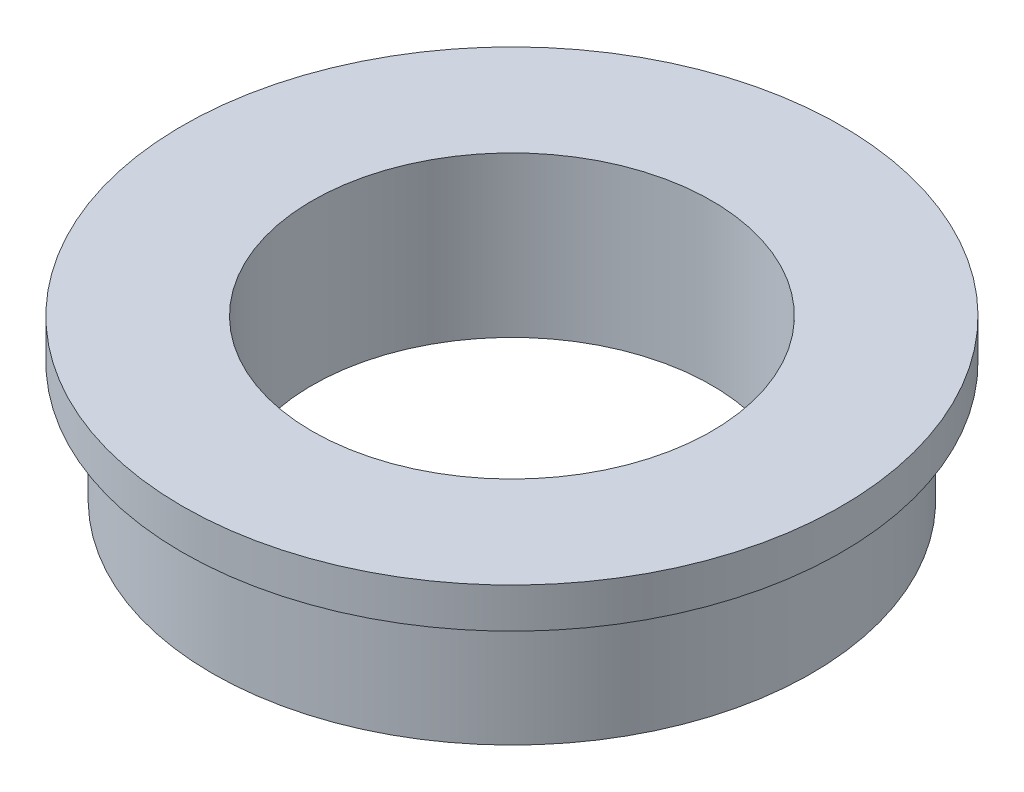
ISO-10303-21;
HEADER;
FILE_DESCRIPTION(('STEP AP214'),'2;1');
FILE_NAME('part.step','',(''),(''),'','','');
FILE_SCHEMA(('AUTOMOTIVE_DESIGN { 1 0 10303 214 1 1 1 1 }'));
ENDSEC;
DATA;
#1=APPLICATION_CONTEXT('core data for automotive mechanical design processes');
#2=APPLICATION_PROTOCOL_DEFINITION('international standard','automotive_design',2000,#1);
#3=PRODUCT_CONTEXT('',#1,'mechanical');
#4=PRODUCT('Part','Part','',(#3));
#5=PRODUCT_RELATED_PRODUCT_CATEGORY('part','',(#4));
#6=PRODUCT_DEFINITION_FORMATION('','',#4);
#7=PRODUCT_DEFINITION_CONTEXT('part definition',#1,'design');
#8=PRODUCT_DEFINITION('design','',#6,#7);
#9=PRODUCT_DEFINITION_SHAPE('','',#8);
#10=(LENGTH_UNIT() NAMED_UNIT(*) SI_UNIT(.MILLI.,.METRE.));
#11=(NAMED_UNIT(*) PLANE_ANGLE_UNIT() SI_UNIT($,.RADIAN.));
#12=(NAMED_UNIT(*) SI_UNIT($,.STERADIAN.) SOLID_ANGLE_UNIT());
#13=UNCERTAINTY_MEASURE_WITH_UNIT(LENGTH_MEASURE(1.E-05),#10,'distance_accuracy_value','');
#14=(GEOMETRIC_REPRESENTATION_CONTEXT(3) GLOBAL_UNCERTAINTY_ASSIGNED_CONTEXT((#13)) GLOBAL_UNIT_ASSIGNED_CONTEXT((#10,
#11,#12)) REPRESENTATION_CONTEXT('',''));
#15=CARTESIAN_POINT('',(0.,0.,0.));
#16=DIRECTION('',(0.,0.,1.));
#17=DIRECTION('',(1.,0.,0.));
#18=AXIS2_PLACEMENT_3D('',#15,#16,#17);
#19=CARTESIAN_POINT('',(0.,-2.06772784651472,-8.25));
#20=DIRECTION('',(0.,-1.,0.));
#21=DIRECTION('',(0.,0.,-1.));
#22=AXIS2_PLACEMENT_3D('',#19,#20,#21);
#23=PLANE('',#22);
#24=CARTESIAN_POINT('',(0.,-2.06772784651472,0.));
#25=DIRECTION('',(0.,1.,0.));
#26=DIRECTION('',(0.,0.,1.));
#27=AXIS2_PLACEMENT_3D('',#24,#25,#26);
#28=CIRCLE('',#27,5.);
#29=CARTESIAN_POINT('',(0.,-2.06772784651472,5.));
#30=VERTEX_POINT('',#29);
#31=EDGE_CURVE('E54',#30,#30,#28,.T.);
#32=ORIENTED_EDGE('',*,*,#31,.F.);
#33=EDGE_LOOP('',(#32));
#34=FACE_BOUND('',#33,.T.);
#35=CARTESIAN_POINT('',(0.,-2.06772784651472,0.));
#36=DIRECTION('',(0.,1.,0.));
#37=DIRECTION('',(0.,0.,1.));
#38=AXIS2_PLACEMENT_3D('',#35,#36,#37);
#39=CIRCLE('',#38,8.25);
#40=CARTESIAN_POINT('',(0.,-2.06772784651472,8.25));
#41=VERTEX_POINT('',#40);
#42=EDGE_CURVE('E10',#41,#41,#39,.T.);
#43=ORIENTED_EDGE('',*,*,#42,.T.);
#44=EDGE_LOOP('',(#43));
#45=FACE_BOUND('',#44,.T.);
#46=ADVANCED_FACE('F32',(#34,#45),#23,.F.);
#47=CARTESIAN_POINT('',(0.,4.00585111251038,0.));
#48=DIRECTION('',(0.,1.,0.));
#49=DIRECTION('',(0.,0.,1.));
#50=AXIS2_PLACEMENT_3D('',#47,#48,#49);
#51=CYLINDRICAL_SURFACE('',#50,8.25);
#52=ORIENTED_EDGE('',*,*,#42,.F.);
#53=EDGE_LOOP('',(#52));
#54=FACE_BOUND('',#53,.T.);
#55=CARTESIAN_POINT('',(0.,-3.06772784651472,0.));
#56=DIRECTION('',(0.,1.,0.));
#57=DIRECTION('',(0.,0.,1.));
#58=AXIS2_PLACEMENT_3D('',#55,#56,#57);
#59=CIRCLE('',#58,8.25);
#60=CARTESIAN_POINT('',(0.,-3.06772784651472,8.25));
#61=VERTEX_POINT('',#60);
#62=EDGE_CURVE('E38',#61,#61,#59,.T.);
#63=ORIENTED_EDGE('',*,*,#62,.T.);
#64=EDGE_LOOP('',(#63));
#65=FACE_BOUND('',#64,.T.);
#66=ADVANCED_FACE('F61',(#54,#65),#51,.T.);
#67=CARTESIAN_POINT('',(0.,-3.06772784651472,-8.25));
#68=DIRECTION('',(0.,1.,0.));
#69=DIRECTION('',(0.,0.,1.));
#70=AXIS2_PLACEMENT_3D('',#67,#68,#69);
#71=PLANE('',#70);
#72=ORIENTED_EDGE('',*,*,#62,.F.);
#73=EDGE_LOOP('',(#72));
#74=FACE_BOUND('',#73,.T.);
#75=CARTESIAN_POINT('',(0.,-3.06772784651472,0.));
#76=DIRECTION('',(0.,1.,0.));
#77=DIRECTION('',(0.,0.,1.));
#78=AXIS2_PLACEMENT_3D('',#75,#76,#77);
#79=CIRCLE('',#78,7.5);
#80=CARTESIAN_POINT('',(0.,-3.06772784651472,7.5));
#81=VERTEX_POINT('',#80);
#82=EDGE_CURVE('E42',#81,#81,#79,.T.);
#83=ORIENTED_EDGE('',*,*,#82,.T.);
#84=EDGE_LOOP('',(#83));
#85=FACE_BOUND('',#84,.T.);
#86=ADVANCED_FACE('F65',(#74,#85),#71,.F.);
#87=CARTESIAN_POINT('',(0.,4.00585111251038,0.));
#88=DIRECTION('',(0.,1.,0.));
#89=DIRECTION('',(0.,0.,1.));
#90=AXIS2_PLACEMENT_3D('',#87,#88,#89);
#91=CYLINDRICAL_SURFACE('',#90,7.5);
#92=ORIENTED_EDGE('',*,*,#82,.F.);
#93=EDGE_LOOP('',(#92));
#94=FACE_BOUND('',#93,.T.);
#95=CARTESIAN_POINT('',(0.,-6.06772784651472,0.));
#96=DIRECTION('',(0.,1.,0.));
#97=DIRECTION('',(0.,0.,1.));
#98=AXIS2_PLACEMENT_3D('',#95,#96,#97);
#99=CIRCLE('',#98,7.5);
#100=CARTESIAN_POINT('',(0.,-6.06772784651472,7.5));
#101=VERTEX_POINT('',#100);
#102=EDGE_CURVE('E46',#101,#101,#99,.T.);
#103=ORIENTED_EDGE('',*,*,#102,.T.);
#104=EDGE_LOOP('',(#103));
#105=FACE_BOUND('',#104,.T.);
#106=ADVANCED_FACE('F70',(#94,#105),#91,.T.);
#107=CARTESIAN_POINT('',(0.,-6.06772784651472,-7.5));
#108=DIRECTION('',(0.,1.,0.));
#109=DIRECTION('',(0.,0.,1.));
#110=AXIS2_PLACEMENT_3D('',#107,#108,#109);
#111=PLANE('',#110);
#112=ORIENTED_EDGE('',*,*,#102,.F.);
#113=EDGE_LOOP('',(#112));
#114=FACE_BOUND('',#113,.T.);
#115=CARTESIAN_POINT('',(0.,-6.06772784651472,0.));
#116=DIRECTION('',(0.,1.,0.));
#117=DIRECTION('',(0.,0.,1.));
#118=AXIS2_PLACEMENT_3D('',#115,#116,#117);
#119=CIRCLE('',#118,5.);
#120=CARTESIAN_POINT('',(0.,-6.06772784651472,5.));
#121=VERTEX_POINT('',#120);
#122=EDGE_CURVE('E51',#121,#121,#119,.T.);
#123=ORIENTED_EDGE('',*,*,#122,.T.);
#124=EDGE_LOOP('',(#123));
#125=FACE_BOUND('',#124,.T.);
#126=ADVANCED_FACE('F76',(#114,#125),#111,.F.);
#127=CARTESIAN_POINT('',(0.,4.00585111251038,0.));
#128=DIRECTION('',(0.,1.,0.));
#129=DIRECTION('',(0.,0.,1.));
#130=AXIS2_PLACEMENT_3D('',#127,#128,#129);
#131=CYLINDRICAL_SURFACE('',#130,5.);
#132=ORIENTED_EDGE('',*,*,#122,.F.);
#133=EDGE_LOOP('',(#132));
#134=FACE_BOUND('',#133,.T.);
#135=ORIENTED_EDGE('',*,*,#31,.T.);
#136=EDGE_LOOP('',(#135));
#137=FACE_BOUND('',#136,.T.);
#138=ADVANCED_FACE('F58',(#134,#137),#131,.F.);
#139=CLOSED_SHELL('',(#46,#66,#86,#106,#126,#138));
#140=MANIFOLD_SOLID_BREP('B2',#139);
#141=ADVANCED_BREP_SHAPE_REPRESENTATION('',(#18,#140),#14);
#142=SHAPE_DEFINITION_REPRESENTATION(#9,#141);
ENDSEC;
END-ISO-10303-21;
